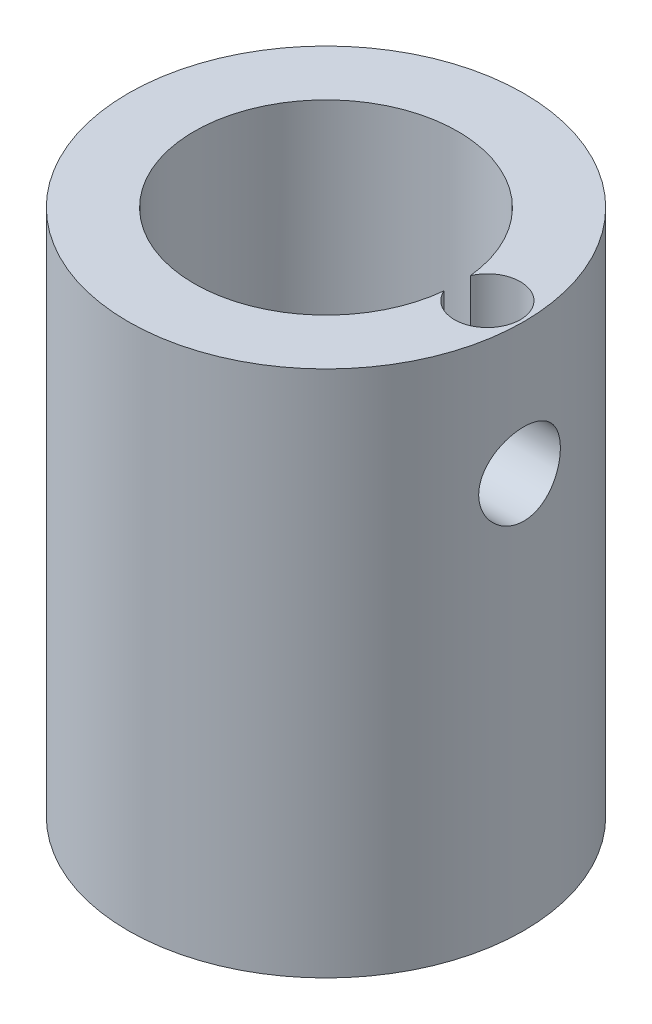
ISO-10303-21;
HEADER;
FILE_DESCRIPTION(('STEP AP214'),'2;1');
FILE_NAME('part.step','',(''),(''),'','','');
FILE_SCHEMA(('AUTOMOTIVE_DESIGN { 1 0 10303 214 1 1 1 1 }'));
ENDSEC;
DATA;
#1=APPLICATION_CONTEXT('core data for automotive mechanical design processes');
#2=APPLICATION_PROTOCOL_DEFINITION('international standard','automotive_design',2000,#1);
#3=PRODUCT_CONTEXT('',#1,'mechanical');
#4=PRODUCT('Part','Part','',(#3));
#5=PRODUCT_RELATED_PRODUCT_CATEGORY('part','',(#4));
#6=PRODUCT_DEFINITION_FORMATION('','',#4);
#7=PRODUCT_DEFINITION_CONTEXT('part definition',#1,'design');
#8=PRODUCT_DEFINITION('design','',#6,#7);
#9=PRODUCT_DEFINITION_SHAPE('','',#8);
#10=(LENGTH_UNIT() NAMED_UNIT(*) SI_UNIT(.MILLI.,.METRE.));
#11=(NAMED_UNIT(*) PLANE_ANGLE_UNIT() SI_UNIT($,.RADIAN.));
#12=(NAMED_UNIT(*) SI_UNIT($,.STERADIAN.) SOLID_ANGLE_UNIT());
#13=UNCERTAINTY_MEASURE_WITH_UNIT(LENGTH_MEASURE(1.E-05),#10,'distance_accuracy_value','');
#14=(GEOMETRIC_REPRESENTATION_CONTEXT(3) GLOBAL_UNCERTAINTY_ASSIGNED_CONTEXT((#13)) GLOBAL_UNIT_ASSIGNED_CONTEXT((#10,
#11,#12)) REPRESENTATION_CONTEXT('',''));
#15=CARTESIAN_POINT('',(0.,0.,0.));
#16=DIRECTION('',(0.,0.,1.));
#17=DIRECTION('',(1.,0.,0.));
#18=AXIS2_PLACEMENT_3D('',#15,#16,#17);
#19=CARTESIAN_POINT('',(0.,80.,0.));
#20=DIRECTION('',(0.,-1.,0.));
#21=DIRECTION('',(0.,0.,-1.));
#22=AXIS2_PLACEMENT_3D('',#19,#20,#21);
#23=CYLINDRICAL_SURFACE('',#22,30.);
#24=CARTESIAN_POINT('',(0.,80.,0.));
#25=DIRECTION('',(0.,1.,0.));
#26=DIRECTION('',(0.,0.,1.));
#27=AXIS2_PLACEMENT_3D('',#24,#25,#26);
#28=CIRCLE('',#27,30.);
#29=CARTESIAN_POINT('',(0.,80.,30.));
#30=VERTEX_POINT('',#29);
#31=EDGE_CURVE('E76',#30,#30,#28,.T.);
#32=ORIENTED_EDGE('',*,*,#31,.F.);
#33=EDGE_LOOP('',(#32));
#34=FACE_BOUND('',#33,.T.);
#35=CARTESIAN_POINT('',(0.,0.,0.));
#36=DIRECTION('',(0.,1.,0.));
#37=DIRECTION('',(0.,0.,1.));
#38=AXIS2_PLACEMENT_3D('',#35,#36,#37);
#39=CIRCLE('',#38,30.);
#40=CARTESIAN_POINT('',(0.,0.,30.));
#41=VERTEX_POINT('',#40);
#42=EDGE_CURVE('E79',#41,#41,#39,.T.);
#43=ORIENTED_EDGE('',*,*,#42,.T.);
#44=EDGE_LOOP('',(#43));
#45=FACE_BOUND('',#44,.T.);
#46=CARTESIAN_POINT('',(29.3532483906951,60.,6.19570891134803));
#47=CARTESIAN_POINT('',(29.353246353925,59.8279373895423,6.1957125374824));
#48=CARTESIAN_POINT('',(29.3547640642741,59.6559192919534,6.18853953342295));
#49=CARTESIAN_POINT('',(29.3607852652423,59.313076969452,6.1599124724872));
#50=CARTESIAN_POINT('',(29.3652892416955,59.1422529433729,6.13845609185349));
#51=CARTESIAN_POINT('',(29.3771549134976,58.8030010858899,6.08141521135679));
#52=CARTESIAN_POINT('',(29.3845180301899,58.6345744895411,6.0458236843916));
#53=CARTESIAN_POINT('',(29.4018872180194,58.3013305931632,5.96078108119698));
#54=CARTESIAN_POINT('',(29.4118942624853,58.136514646597,5.91132490045903));
#55=CARTESIAN_POINT('',(29.4342423589189,57.8119386166724,5.79902115556941));
#56=CARTESIAN_POINT('',(29.4465800848149,57.6521717026327,5.73619265880657));
#57=CARTESIAN_POINT('',(29.473249612199,57.3384803173955,5.59754760980832));
#58=CARTESIAN_POINT('',(29.4875821490523,57.1845580275106,5.52172626550714));
#59=CARTESIAN_POINT('',(29.517825800768,56.883713475229,5.35769617764507));
#60=CARTESIAN_POINT('',(29.5337362301871,56.7367882139946,5.26949280603089));
#61=CARTESIAN_POINT('',(29.5667035876194,56.4507803317589,5.08125660367141));
#62=CARTESIAN_POINT('',(29.5837609430631,56.3117006705233,4.98121935207178));
#63=CARTESIAN_POINT('',(29.6187764137092,56.0405762486728,4.76863051338756));
#64=CARTESIAN_POINT('',(29.6367434304656,55.9086481928679,4.65593152670186));
#65=CARTESIAN_POINT('',(29.6728708400931,55.6546711457032,4.41984144744208));
#66=CARTESIAN_POINT('',(29.6910313021796,55.5326258346403,4.29644640679302));
#67=CARTESIAN_POINT('',(29.7270288306404,55.2993260877785,4.03986753323509));
#68=CARTESIAN_POINT('',(29.7448659901802,55.1880685017752,3.90668657807489));
#69=CARTESIAN_POINT('',(29.7797346125942,54.9770287239509,3.63134519963968));
#70=CARTESIAN_POINT('',(29.7967657761627,54.8772507756992,3.48918148568574));
#71=CARTESIAN_POINT('',(29.8296902119785,54.6890782436484,3.19555844128118));
#72=CARTESIAN_POINT('',(29.8455718958802,54.6007938983129,3.04402711583113));
#73=CARTESIAN_POINT('',(29.8755826985667,54.437292867655,2.73383528442119));
#74=CARTESIAN_POINT('',(29.8897111587746,54.3620810886559,2.57517212978056));
#75=CARTESIAN_POINT('',(29.9157988886229,54.225370219494,2.2519354971806));
#76=CARTESIAN_POINT('',(29.9277591295908,54.1638649861722,2.08736470553058));
#77=CARTESIAN_POINT('',(29.9491822197055,54.0549915647281,1.75345483518811));
#78=CARTESIAN_POINT('',(29.958644162967,54.007628503759,1.58411405145559));
#79=CARTESIAN_POINT('',(29.9826020405662,53.8885679309219,1.07556432546471));
#80=CARTESIAN_POINT('',(29.9930812308343,53.8378145573566,0.730879967415714));
#81=CARTESIAN_POINT('',(29.9997596200984,53.8054604126224,0.211591695517816));
#82=CARTESIAN_POINT('',(30.0004774770096,53.8019791393531,0.0380480317404797));
#83=CARTESIAN_POINT('',(29.9989119509306,53.8095598027702,-0.308729160337855));
#84=CARTESIAN_POINT('',(29.9966285218888,53.8206219626098,-0.481962683839248));
#85=CARTESIAN_POINT('',(29.9854449305899,53.8750314506655,-0.993942017413891));
#86=CARTESIAN_POINT('',(29.9722798047128,53.9392633016099,-1.33061116961305));
#87=CARTESIAN_POINT('',(29.9358672881531,54.1220046161494,-1.98811026191351));
#88=CARTESIAN_POINT('',(29.9126194755526,54.2405163511394,-2.30893953855726));
#89=CARTESIAN_POINT('',(29.8583668564008,54.5292546769044,-2.92834957463891));
#90=CARTESIAN_POINT('',(29.8273114691532,54.6998200972894,-3.22676810539984));
#91=CARTESIAN_POINT('',(29.7608595896882,55.0875717274217,-3.79105705118674));
#92=CARTESIAN_POINT('',(29.7254625668109,55.3047636385677,-4.0569234795546));
#93=CARTESIAN_POINT('',(29.6534559164373,55.7843884654043,-4.5537713207849));
#94=CARTESIAN_POINT('',(29.6168359777846,56.047586764914,-4.78401304852448));
#95=CARTESIAN_POINT('',(29.5471317171544,56.6092321126755,-5.19721566642975));
#96=CARTESIAN_POINT('',(29.514047471231,56.9076799188678,-5.38017553966375));
#97=CARTESIAN_POINT('',(29.4551377834795,57.5324599116484,-5.693901900287));
#98=CARTESIAN_POINT('',(29.4293299803094,57.8588573978365,-5.82454187678811));
#99=CARTESIAN_POINT('',(29.3881487275834,58.529628064925,-6.02890481244648));
#100=CARTESIAN_POINT('',(29.3727738193511,58.8739987256503,-6.10263572854902));
#101=CARTESIAN_POINT('',(29.3544932159667,59.5642171019444,-6.18996799972374));
#102=CARTESIAN_POINT('',(29.3513653994408,59.9099235426462,-6.20464061413359));
#103=CARTESIAN_POINT('',(29.3573359009114,60.5988436255209,-6.17632831510769));
#104=CARTESIAN_POINT('',(29.3664334764793,60.9420574177959,-6.13334690291011));
#105=CARTESIAN_POINT('',(29.3956210788608,61.6126051687693,-5.991872551742));
#106=CARTESIAN_POINT('',(29.4155965196046,61.9400665918975,-5.89395795243787));
#107=CARTESIAN_POINT('',(29.4641877047359,62.5739367129047,-5.64601647669012));
#108=CARTESIAN_POINT('',(29.4928042006705,62.880343576738,-5.49598506726903));
#109=CARTESIAN_POINT('',(29.5559483018901,63.4680756935268,-5.14567039007435));
#110=CARTESIAN_POINT('',(29.5905522351096,63.7489951290846,-4.94472037853521));
#111=CARTESIAN_POINT('',(29.6615660543381,64.2735205257486,-4.49913890798842));
#112=CARTESIAN_POINT('',(29.6979761388411,64.5171223736133,-4.2545026401948));
#113=CARTESIAN_POINT('',(29.7692227410128,64.9641747256337,-3.72373494258727));
#114=CARTESIAN_POINT('',(29.8040235094208,65.1668986223412,-3.43698697865907));
#115=CARTESIAN_POINT('',(29.8675039652918,65.5213391544301,-2.83268676901214));
#116=CARTESIAN_POINT('',(29.896183920353,65.6730580198863,-2.51513587086153));
#117=CARTESIAN_POINT('',(29.9321058958336,65.8584396811344,-2.02387067137091));
#118=CARTESIAN_POINT('',(29.9428789333607,65.9131171948548,-1.85805440260508));
#119=CARTESIAN_POINT('',(29.9618233688853,66.0083170123022,-1.52227725878781));
#120=CARTESIAN_POINT('',(29.9699957229573,66.0488445184494,-1.35231793162088));
#121=CARTESIAN_POINT('',(29.9835025459055,66.1154142061507,-1.00947065775587));
#122=CARTESIAN_POINT('',(29.9888367685993,66.141455131133,-0.8365824583461));
#123=CARTESIAN_POINT('',(29.9965148369705,66.1788388142323,-0.489159883490491));
#124=CARTESIAN_POINT('',(29.9988587943078,66.1901821211757,-0.314625569757645));
#125=CARTESIAN_POINT('',(30.000473507162,66.1980022637404,0.0315466013501721));
#126=CARTESIAN_POINT('',(29.9998004638372,66.1947509683032,0.20317813050534));
#127=CARTESIAN_POINT('',(29.9955278511958,66.1740264686631,0.545541023431393));
#128=CARTESIAN_POINT('',(29.9919283383264,66.1565535387743,0.716272404500853));
#129=CARTESIAN_POINT('',(29.981901902709,66.1075220249225,1.05564357140904));
#130=CARTESIAN_POINT('',(29.9754745164708,66.0759611319208,1.22428300971632));
#131=CARTESIAN_POINT('',(29.9599728267241,65.9990164617122,1.55818923155108));
#132=CARTESIAN_POINT('',(29.9508994680988,65.9536376186734,1.72345719653722));
#133=CARTESIAN_POINT('',(29.9303773552664,65.8495208432383,2.04916604521535));
#134=CARTESIAN_POINT('',(29.918933975402,65.7908131074094,2.20961692573224));
#135=CARTESIAN_POINT('',(29.8939747924758,65.660444069556,2.52493107031361));
#136=CARTESIAN_POINT('',(29.8804597224677,65.5887873478453,2.67979628697717));
#137=CARTESIAN_POINT('',(29.8517125198947,65.4329927449312,2.98302979622553));
#138=CARTESIAN_POINT('',(29.8364796751343,65.3488496822454,3.13139535837179));
#139=CARTESIAN_POINT('',(29.8047155864862,65.1687264593224,3.42053777359005));
#140=CARTESIAN_POINT('',(29.7881847875861,65.0727503495195,3.56131719980354));
#141=CARTESIAN_POINT('',(29.7539647248054,64.867813375006,3.83682022271946));
#142=CARTESIAN_POINT('',(29.7362602618589,64.7586548608196,3.97139494660367));
#143=CARTESIAN_POINT('',(29.7004544511816,64.5295253451687,4.23085743434911));
#144=CARTESIAN_POINT('',(29.6823532445249,64.4095581413312,4.35574857205939));
#145=CARTESIAN_POINT('',(29.646237784645,64.1595111874748,4.59513331214217));
#146=CARTESIAN_POINT('',(29.6282235899244,64.0294254301634,4.70962064906876));
#147=CARTESIAN_POINT('',(29.5928017004414,63.7601234721796,4.92729605485228));
#148=CARTESIAN_POINT('',(29.5753937856481,63.6209106379053,5.03048825269439));
#149=CARTESIAN_POINT('',(29.5414637745758,63.3325119895073,5.22607811831578));
#150=CARTESIAN_POINT('',(29.5249548644251,63.1832262944427,5.31833088756377));
#151=CARTESIAN_POINT('',(29.4935397496458,62.8772969641982,5.48987402771749));
#152=CARTESIAN_POINT('',(29.4786329552918,62.7206560671252,5.56916917384908));
#153=CARTESIAN_POINT('',(29.4508640998844,62.4011462387229,5.71419809023623));
#154=CARTESIAN_POINT('',(29.438000833157,62.2382810506037,5.77993986380141));
#155=CARTESIAN_POINT('',(29.4146958345939,61.9074566050944,5.897392662984));
#156=CARTESIAN_POINT('',(29.4042536457626,61.7394983158423,5.94910633681787));
#157=CARTESIAN_POINT('',(29.381537445301,61.3139698859119,6.06052953791443));
#158=CARTESIAN_POINT('',(29.3709892696971,61.0538682346629,6.111150176068));
#159=CARTESIAN_POINT('',(29.356846443351,60.5291425372001,6.17873642037534));
#160=CARTESIAN_POINT('',(29.3532515219023,60.2645186674516,6.19570333674802));
#161=CARTESIAN_POINT('',(29.3532483906951,60.,6.19570891134803));
#162=B_SPLINE_CURVE_WITH_KNOTS('',3,(#46,#47,#48,#49,#50,#51,#52,#53,#54,#55,#56,#57,#58,#59,
#60,#61,#62,#63,#64,#65,#66,#67,#68,#69,#70,#71,#72,#73,#74,#75,#76,#77,#78,#79,#80,#81,#82,#83,
#84,#85,#86,#87,#88,#89,#90,#91,#92,#93,#94,#95,#96,#97,#98,#99,#100,#101,#102,#103,#104,#105,
#106,#107,#108,#109,#110,#111,#112,#113,#114,#115,#116,#117,#118,#119,#120,#121,#122,#123,#124,
#125,#126,#127,#128,#129,#130,#131,#132,#133,#134,#135,#136,#137,#138,#139,#140,#141,#142,#143,
#144,#145,#146,#147,#148,#149,#150,#151,#152,#153,#154,#155,#156,#157,#158,#159,#160,#161),
.UNSPECIFIED.,.T.,.F.,(4,2,2,2,2,2,2,2,2,2,2,2,2,2,2,2,2,2,2,2,2,2,2,2,2,2,2,2,2,2,2,2,2,2,2,2,
2,2,2,2,2,2,2,2,2,2,2,2,2,2,2,2,2,2,2,2,2,4),(0.,0.515955181010521,1.03199432310506,
1.54829032905197,2.06477666836801,2.58053143296204,3.09647683100171,3.6121990738038,
4.12811459016278,4.65082143216769,5.17372204151332,5.69646949192882,6.21940956476584,
6.7470444374867,7.2748769135994,7.80247234169866,8.33025881451432,9.3698782255065,
9.89010873409632,10.410347225149,11.4340803368338,12.4578562915477,13.4884437603046,
14.519157319194,15.569015551175,16.6188963614853,17.6713007019699,18.7235578700822,
19.756639705587,20.7896588065001,21.8120009755398,22.8344320873764,23.8710135549175,
24.9077091950816,25.9614627524627,27.0151702309594,27.5394357720417,28.0635083571246,
28.5876263933899,29.1117248579095,29.6261013264392,30.1404678736538,30.6549187573026,
31.1691861537955,31.6822999034147,32.1952325085006,32.7083785646005,33.2213494567062,
33.7432871598374,34.2650421902986,34.7871093815573,35.3089850870876,35.8371431339964,
36.3651060996236,36.892756402772,37.4203070269749,38.2135362496047,39.0067345893404),.UNSPECIFIED.);
#163=CARTESIAN_POINT('',(29.3532483906951,60.,6.19570891134803));
#164=VERTEX_POINT('',#163);
#165=EDGE_CURVE('E71',#164,#164,#162,.T.);
#166=ORIENTED_EDGE('',*,*,#165,.F.);
#167=EDGE_LOOP('',(#166));
#168=FACE_BOUND('',#167,.T.);
#169=ADVANCED_FACE('F33',(#34,#45,#168),#23,.T.);
#170=CARTESIAN_POINT('',(0.,3.,0.));
#171=DIRECTION('',(0.,1.,0.));
#172=DIRECTION('',(0.,0.,1.));
#173=AXIS2_PLACEMENT_3D('',#170,#171,#172);
#174=CYLINDRICAL_SURFACE('',#173,20.);
#175=CARTESIAN_POINT('',(0.,3.,0.));
#176=DIRECTION('',(0.,1.,0.));
#177=DIRECTION('',(0.,0.,1.));
#178=AXIS2_PLACEMENT_3D('',#175,#176,#177);
#179=CIRCLE('',#178,20.);
#180=CARTESIAN_POINT('',(0.,3.,20.));
#181=VERTEX_POINT('',#180);
#182=EDGE_CURVE('E82',#181,#181,#179,.T.);
#183=ORIENTED_EDGE('',*,*,#182,.F.);
#184=EDGE_LOOP('',(#183));
#185=FACE_BOUND('',#184,.T.);
#186=CARTESIAN_POINT('',(19.0161297609646,60.,6.19570891134803));
#187=CARTESIAN_POINT('',(19.0161212499526,60.1695392528851,6.19572131240288));
#188=CARTESIAN_POINT('',(19.0184014247644,60.3389698933915,6.18874879190105));
#189=CARTESIAN_POINT('',(19.0274149100442,60.6765970582187,6.16098235585591));
#190=CARTESIAN_POINT('',(19.0341484790479,60.8447935103172,6.14018763788359));
#191=CARTESIAN_POINT('',(19.060779649376,61.3456518933459,6.05725285467361));
#192=CARTESIAN_POINT('',(19.0871081089449,61.6748134470954,5.97456186983717));
#193=CARTESIAN_POINT('',(19.1536683759922,62.3131961498796,5.75757410409601));
#194=CARTESIAN_POINT('',(19.1938758965004,62.6224510193744,5.62336742485627));
#195=CARTESIAN_POINT('',(19.2836574150221,63.2143122419485,5.30729724994926));
#196=CARTESIAN_POINT('',(19.3332330127038,63.4969140314449,5.12542561308388));
#197=CARTESIAN_POINT('',(19.4113796448308,63.8995693711788,4.81767678918897));
#198=CARTESIAN_POINT('',(19.4384988047976,64.0320757592885,4.70732372854738));
#199=CARTESIAN_POINT('',(19.4930606370278,64.2873927484723,4.47601332479218));
#200=CARTESIAN_POINT('',(19.5205031972625,64.4102065998735,4.35505956551515));
#201=CARTESIAN_POINT('',(19.5749854267719,64.6454251518352,4.10323631812367));
#202=CARTESIAN_POINT('',(19.6020248884163,64.7578246336575,3.97236191776678));
#203=CARTESIAN_POINT('',(19.6549526595593,64.971385090689,3.70160145221855));
#204=CARTESIAN_POINT('',(19.68084139157,65.072550211593,3.56171874157468));
#205=CARTESIAN_POINT('',(19.7313491541909,65.2651479755814,3.2705025007975));
#206=CARTESIAN_POINT('',(19.7559261447623,65.3563082792318,3.11898137299935));
#207=CARTESIAN_POINT('',(19.802455905572,65.5254574825797,2.80844720670818));
#208=CARTESIAN_POINT('',(19.8244097038198,65.6034515470068,2.6494371373604));
#209=CARTESIAN_POINT('',(19.8650807758115,65.7456845504812,2.32493171712255));
#210=CARTESIAN_POINT('',(19.8837973079344,65.8099203384639,2.15943489081296));
#211=CARTESIAN_POINT('',(19.9174356340138,65.9240210007936,1.82325971356578));
#212=CARTESIAN_POINT('',(19.9323590889091,65.9738921664994,1.65258366731712));
#213=CARTESIAN_POINT('',(19.9575965923238,66.0575583444988,1.31245640378635));
#214=CARTESIAN_POINT('',(19.9680354532876,66.0917906212314,1.14312195630659));
#215=CARTESIAN_POINT('',(19.9846405857409,66.146001595288,0.802045730115178));
#216=CARTESIAN_POINT('',(19.9908085769596,66.1659860298135,0.630304948803489));
#217=CARTESIAN_POINT('',(19.9987028311384,66.1915322611803,0.285652116012715));
#218=CARTESIAN_POINT('',(20.0004290970454,66.1970940675897,0.112740065310753));
#219=CARTESIAN_POINT('',(19.9993903373656,66.1937408696568,-0.232928311827829));
#220=CARTESIAN_POINT('',(19.9966254002156,66.1848261503732,-0.405684641263752));
#221=CARTESIAN_POINT('',(19.9868541083336,66.1531586840393,-0.743837225473005));
#222=CARTESIAN_POINT('',(19.9799958881157,66.1308891160104,-0.909283288736585));
#223=CARTESIAN_POINT('',(19.9623437487043,66.0731156086434,-1.23769233762555));
#224=CARTESIAN_POINT('',(19.9515484917948,66.0376071709457,-1.40065445963396));
#225=CARTESIAN_POINT('',(19.9263100957244,65.9536747110177,-1.72286830911467));
#226=CARTESIAN_POINT('',(19.9118681422915,65.9052548866557,-1.88212122429196));
#227=CARTESIAN_POINT('',(19.8797023780237,65.7958698510993,-2.19598072795561));
#228=CARTESIAN_POINT('',(19.86197733221,65.7348999180512,-2.35058554247585));
#229=CARTESIAN_POINT('',(19.8234759691749,65.6001095624441,-2.65589021726005));
#230=CARTESIAN_POINT('',(19.8026662937193,65.526146768142,-2.80652298370574));
#231=CARTESIAN_POINT('',(19.7586810458448,65.3663937517124,-3.10108200344967));
#232=CARTESIAN_POINT('',(19.7355046628914,65.2805994740668,-3.24500593440607));
#233=CARTESIAN_POINT('',(19.6873798325461,65.097794312439,-3.52523616388491));
#234=CARTESIAN_POINT('',(19.6624313243396,65.0007830434479,-3.6615422006945));
#235=CARTESIAN_POINT('',(19.61139171264,64.796176260086,-3.92573821205312));
#236=CARTESIAN_POINT('',(19.5853005734798,64.6885804151898,-4.05362792357657));
#237=CARTESIAN_POINT('',(19.5315475636985,64.458827082163,-4.30533247351813));
#238=CARTESIAN_POINT('',(19.5038652663148,64.3362522993907,-4.42876236146993));
#239=CARTESIAN_POINT('',(19.4487452466801,64.0811761342746,-4.66486915861869));
#240=CARTESIAN_POINT('',(19.421307449155,63.9486779341465,-4.77754948882388));
#241=CARTESIAN_POINT('',(19.3674195681297,63.674482779979,-4.99151681197244));
#242=CARTESIAN_POINT('',(19.3409699725187,63.5327813743056,-5.09279822549468));
#243=CARTESIAN_POINT('',(19.2898388886837,63.2411856267849,-5.28316470474441));
#244=CARTESIAN_POINT('',(19.2651567137931,63.0912945070942,-5.37225451946231));
#245=CARTESIAN_POINT('',(19.2180107358053,62.7824960399876,-5.5385577366134));
#246=CARTESIAN_POINT('',(19.1955750800588,62.6235060947416,-5.61562591955036));
#247=CARTESIAN_POINT('',(19.1539493944526,62.2992231362806,-5.75600424416786));
#248=CARTESIAN_POINT('',(19.1347581175541,62.1339325749021,-5.81931967465847));
#249=CARTESIAN_POINT('',(19.1002301102528,61.7981865024331,-5.93166646348126));
#250=CARTESIAN_POINT('',(19.0848930317962,61.6277314592804,-5.98069911168469));
#251=CARTESIAN_POINT('',(19.0585820651715,61.2829262203343,-6.06402203614821));
#252=CARTESIAN_POINT('',(19.047607988069,61.1085761935536,-6.09831295078559));
#253=CARTESIAN_POINT('',(19.0307371651006,60.7642967623356,-6.15075361514062));
#254=CARTESIAN_POINT('',(19.0246567739343,60.5944652466617,-6.16948811806385));
#255=CARTESIAN_POINT('',(19.0170599066417,60.2537349943093,-6.19286570343731));
#256=CARTESIAN_POINT('',(19.0155432982386,60.0828362887062,-6.19750919430187));
#257=CARTESIAN_POINT('',(19.0171228927843,59.7412851892966,-6.19266039301225));
#258=CARTESIAN_POINT('',(19.0202184724694,59.5706327653283,-6.18317001082566));
#259=CARTESIAN_POINT('',(19.03092132361,59.2308367032177,-6.15014909725777));
#260=CARTESIAN_POINT('',(19.0385285528335,59.0616930509673,-6.12661869729986));
#261=CARTESIAN_POINT('',(19.0577333283313,58.7309494079098,-6.06661023446674));
#262=CARTESIAN_POINT('',(19.0692109942378,58.5692717989532,-6.03052021942684));
#263=CARTESIAN_POINT('',(19.0958597892953,58.2495549003444,-5.94559651725915));
#264=CARTESIAN_POINT('',(19.1110321496676,58.0915168427938,-5.89675858161846));
#265=CARTESIAN_POINT('',(19.1446279932618,57.7801943483155,-5.78675403954404));
#266=CARTESIAN_POINT('',(19.1630507128464,57.626908804759,-5.72559032844075));
#267=CARTESIAN_POINT('',(19.202643442659,57.3259411385565,-5.59136650487168));
#268=CARTESIAN_POINT('',(19.2238144923606,57.1782611635012,-5.51830188856843));
#269=CARTESIAN_POINT('',(19.2689490329168,56.8854019629973,-5.35860765646827));
#270=CARTESIAN_POINT('',(19.2929739810124,56.740407650061,-5.27165628715144));
#271=CARTESIAN_POINT('',(19.3426620920464,56.4581505594042,-5.08631770543694));
#272=CARTESIAN_POINT('',(19.3683258198593,56.3208904786369,-4.98792654013424));
#273=CARTESIAN_POINT('',(19.4205960860829,56.0549572226254,-4.78036590954075));
#274=CARTESIAN_POINT('',(19.4472026776598,55.9262845327897,-4.67119583582766));
#275=CARTESIAN_POINT('',(19.5006583187283,55.6782933903492,-4.44275631502535));
#276=CARTESIAN_POINT('',(19.5275073727569,55.5589751131877,-4.32348667860458));
#277=CARTESIAN_POINT('',(19.5818417099268,55.3257387041607,-4.07048977871195));
#278=CARTESIAN_POINT('',(19.6093081525541,55.2122405384819,-3.93637086789064));
#279=CARTESIAN_POINT('',(19.6629764212384,54.9969693351216,-3.65886871758531));
#280=CARTESIAN_POINT('',(19.6891786720705,54.895192342894,-3.515488628316));
#281=CARTESIAN_POINT('',(19.7396084389484,54.704014961694,-3.22029246725892));
#282=CARTESIAN_POINT('',(19.7638352338819,54.6146190840276,-3.06847334863091));
#283=CARTESIAN_POINT('',(19.8096132554116,54.4489710393623,-2.75751795533781));
#284=CARTESIAN_POINT('',(19.8311655892899,54.3727134277364,-2.59838474650539));
#285=CARTESIAN_POINT('',(19.8708531838593,54.2344146557152,-2.27498233424764));
#286=CARTESIAN_POINT('',(19.8890114115199,54.1722772798371,-2.11075712524186));
#287=CARTESIAN_POINT('',(19.9215728994984,54.0621008139767,-1.77734997508511));
#288=CARTESIAN_POINT('',(19.9359776583114,54.0140560968248,-1.60817004210527));
#289=CARTESIAN_POINT('',(19.9606239795337,53.9324772698427,-1.26605642384677));
#290=CARTESIAN_POINT('',(19.9708657708298,53.8989423622322,-1.09312294549526));
#291=CARTESIAN_POINT('',(19.9868861512344,53.8467043573351,-0.744827362645454));
#292=CARTESIAN_POINT('',(19.9926649014487,53.8280007246718,-0.569465346044626));
#293=CARTESIAN_POINT('',(19.999446479878,53.8060699198237,-0.224939586480327));
#294=CARTESIAN_POINT('',(20.0006360682198,53.8022375099906,-0.0558177600727351));
#295=CARTESIAN_POINT('',(19.9987232678337,53.8084129125743,0.282208367463739));
#296=CARTESIAN_POINT('',(19.9956194114587,53.8184254576729,0.451112574444826));
#297=CARTESIAN_POINT('',(19.985204153134,53.8521995152879,0.787332863963706));
#298=CARTESIAN_POINT('',(19.9778945862189,53.8759550314992,0.954649606800239));
#299=CARTESIAN_POINT('',(19.9592643768583,53.9370067024604,1.28662993016474));
#300=CARTESIAN_POINT('',(19.947942236909,53.9743079126311,1.45129249612719));
#301=CARTESIAN_POINT('',(19.9217570330026,54.061572568294,1.77470877473025));
#302=CARTESIAN_POINT('',(19.9069400833507,54.1113716100715,1.93351065864632));
#303=CARTESIAN_POINT('',(19.8740693838451,54.2234687303016,2.24635605886213));
#304=CARTESIAN_POINT('',(19.8560144716554,54.2857712981225,2.40039784306657));
#305=CARTESIAN_POINT('',(19.8171355265992,54.4223702885719,2.70265704909591));
#306=CARTESIAN_POINT('',(19.7963121458821,54.4966638874344,2.85087583198555));
#307=CARTESIAN_POINT('',(19.7524069582953,54.6567505467495,3.14068633703466));
#308=CARTESIAN_POINT('',(19.7293242980249,54.7425479571143,3.28227552490048));
#309=CARTESIAN_POINT('',(19.6806854475628,54.928071025087,3.56251471437829));
#310=CARTESIAN_POINT('',(19.6550726300488,55.0281640832201,3.70091174051971));
#311=CARTESIAN_POINT('',(19.6027171822216,55.2393492561337,3.96889523633343));
#312=CARTESIAN_POINT('',(19.5759741339696,55.350445460442,4.09847839975583));
#313=CARTESIAN_POINT('',(19.5220721453129,55.582887096964,4.347986964095));
#314=CARTESIAN_POINT('',(19.4949132390823,55.7042316906514,4.46791315358283));
#315=CARTESIAN_POINT('',(19.4408870606861,55.9564769342177,4.69742672128967));
#316=CARTESIAN_POINT('',(19.4140199004193,56.0873811116089,4.80701024849543));
#317=CARTESIAN_POINT('',(19.3604594246975,56.3622877317485,5.01845489487124));
#318=CARTESIAN_POINT('',(19.3337997116495,56.5065765727687,5.11995258638976));
#319=CARTESIAN_POINT('',(19.2823565635445,56.8035234935873,5.3104105201597));
#320=CARTESIAN_POINT('',(19.2575731254251,56.9561815597256,5.39937078287371));
#321=CARTESIAN_POINT('',(19.2106413506404,57.2688066964315,5.56404451623929));
#322=CARTESIAN_POINT('',(19.1884921026204,57.4287712125102,5.63976257260803));
#323=CARTESIAN_POINT('',(19.1475132766086,57.7549497163595,5.77736016323861));
#324=CARTESIAN_POINT('',(19.1286834875091,57.9211633058915,5.83924057760031));
#325=CARTESIAN_POINT('',(19.0964804263588,58.2433930443799,5.94366518905036));
#326=CARTESIAN_POINT('',(19.0827677133007,58.3989722154127,5.9874518896817));
#327=CARTESIAN_POINT('',(19.0589623194325,58.7133287703397,6.06279416965477));
#328=CARTESIAN_POINT('',(19.0488705755954,58.8721069708151,6.0943465833854));
#329=CARTESIAN_POINT('',(19.0245194056888,59.3516624558221,6.17015613342455));
#330=CARTESIAN_POINT('',(19.0161460245528,59.676029526517,6.19568521432484));
#331=CARTESIAN_POINT('',(19.0161297609646,60.,6.19570891134803));
#332=B_SPLINE_CURVE_WITH_KNOTS('',3,(#186,#187,#188,#189,#190,#191,#192,#193,#194,#195,#196,
#197,#198,#199,#200,#201,#202,#203,#204,#205,#206,#207,#208,#209,#210,#211,#212,#213,#214,#215,
#216,#217,#218,#219,#220,#221,#222,#223,#224,#225,#226,#227,#228,#229,#230,#231,#232,#233,#234,
#235,#236,#237,#238,#239,#240,#241,#242,#243,#244,#245,#246,#247,#248,#249,#250,#251,#252,#253,
#254,#255,#256,#257,#258,#259,#260,#261,#262,#263,#264,#265,#266,#267,#268,#269,#270,#271,#272,
#273,#274,#275,#276,#277,#278,#279,#280,#281,#282,#283,#284,#285,#286,#287,#288,#289,#290,#291,
#292,#293,#294,#295,#296,#297,#298,#299,#300,#301,#302,#303,#304,#305,#306,#307,#308,#309,#310,
#311,#312,#313,#314,#315,#316,#317,#318,#319,#320,#321,#322,#323,#324,#325,#326,#327,#328,#329,
#330,#331),.UNSPECIFIED.,.T.,.F.,(4,2,2,2,2,2,2,2,2,2,2,2,2,2,2,2,2,2,2,2,2,2,2,2,2,2,2,2,2,2,2,
2,2,2,2,2,2,2,2,2,2,2,2,2,2,2,2,2,2,2,2,2,2,2,2,2,2,2,2,2,2,2,2,2,2,2,2,2,2,2,2,2,4),(0.,
0.508251369471302,1.01653224736694,2.03241137920862,3.04652176112206,4.06080546659674,
4.58399918354552,5.10701669882532,5.6302949014357,6.1533793581289,6.68831163494246,
7.22303358342454,7.75787786888369,8.29248754798364,8.81106449814046,9.32943251396421,
9.84780018589083,10.3661576507036,10.8668055360145,11.3676236888656,11.868279209251,
12.3691234417376,12.8758436529278,13.3827379880697,13.8896497268805,14.3965773000954,
14.9243896157198,15.4520333926584,15.9799343220898,16.5076290294874,17.0412730139376,
17.5747114134865,18.108101623522,18.6414687332548,19.1537408533738,19.6659981256398,
20.178186180784,20.690369441601,21.1879581006685,21.6857128038334,22.1833507201899,
22.6811774045487,23.1929020732333,23.7048040916263,24.2167350211891,24.7286755497956,
25.2615376735969,25.7942194878298,26.3270948875152,26.8597489244186,27.3886566791132,
27.9173529536324,28.4460201556002,28.9746682729638,29.4815605258211,29.9886260947301,
30.4954705885073,31.0025044376583,31.5031892702465,32.0040541954733,32.5048013437278,
33.0057383752599,33.5232792707932,34.0410132472431,34.5587049035079,35.0765885641749,
35.611188195527,36.1457869543374,36.6802002158147,37.2145794779374,37.7006373324957,
38.186820870308,39.1580321621708),.UNSPECIFIED.);
#333=CARTESIAN_POINT('',(19.8992479272115,65.862326925615,-2.0049767907304));
#334=VERTEX_POINT('',#333);
#335=CARTESIAN_POINT('',(19.8992479272115,65.8623269256149,2.0049767907304));
#336=VERTEX_POINT('',#335);
#337=EDGE_CURVE('E52',#334,#336,#332,.T.);
#338=ORIENTED_EDGE('',*,*,#337,.F.);
#339=DIRECTION('',(0.,1.,0.));
#340=VECTOR('',#339,1.);
#341=CARTESIAN_POINT('',(19.8992479272115,70.,-2.0049767907304));
#342=LINE('',#341,#340);
#343=CARTESIAN_POINT('',(19.8992479272115,80.,-2.0049767907304));
#344=VERTEX_POINT('',#343);
#345=EDGE_CURVE('E47',#334,#344,#342,.T.);
#346=ORIENTED_EDGE('',*,*,#345,.T.);
#347=CARTESIAN_POINT('',(0.,80.,0.));
#348=DIRECTION('',(0.,1.,0.));
#349=DIRECTION('',(0.,0.,1.));
#350=AXIS2_PLACEMENT_3D('',#347,#348,#349);
#351=CIRCLE('',#350,20.);
#352=CARTESIAN_POINT('',(19.8992479272115,80.,2.0049767907304));
#353=VERTEX_POINT('',#352);
#354=EDGE_CURVE('E85',#344,#353,#351,.T.);
#355=ORIENTED_EDGE('',*,*,#354,.T.);
#356=DIRECTION('',(0.,1.,0.));
#357=VECTOR('',#356,1.);
#358=CARTESIAN_POINT('',(19.8992479272115,70.,2.0049767907304));
#359=LINE('',#358,#357);
#360=EDGE_CURVE('E59',#353,#336,#359,.F.);
#361=ORIENTED_EDGE('',*,*,#360,.T.);
#362=EDGE_LOOP('',(#338,#346,#355,#361));
#363=FACE_BOUND('',#362,.T.);
#364=ADVANCED_FACE('F69',(#185,#363),#174,.F.);
#365=CARTESIAN_POINT('',(24.4796483538808,60.,0.));
#366=DIRECTION('',(0.,1.,0.));
#367=DIRECTION('',(0.,0.,1.));
#368=AXIS2_PLACEMENT_3D('',#365,#366,#367);
#369=CYLINDRICAL_SURFACE('',#368,5.);
#370=CARTESIAN_POINT('',(19.8992479272115,65.862326925615,2.00497679073039));
#371=CARTESIAN_POINT('',(19.9589028368991,65.8157330794499,2.1412644754));
#372=CARTESIAN_POINT('',(20.0240939514208,65.7651365860846,2.27363556602785));
#373=CARTESIAN_POINT('',(20.1644531304792,65.657353719943,2.52989970248008));
#374=CARTESIAN_POINT('',(20.239607301248,65.6001765385015,2.65380419705853));
#375=CARTESIAN_POINT('',(20.3985923873434,65.4807932338684,2.892306579062));
#376=CARTESIAN_POINT('',(20.4823808099951,65.4186120404885,3.00694551544934));
#377=CARTESIAN_POINT('',(20.6581680630153,65.2902652748716,3.22740948730446));
#378=CARTESIAN_POINT('',(20.7501697666503,65.2240983109391,3.33323141307506));
#379=CARTESIAN_POINT('',(20.9412146114405,65.0894745510264,3.53535293374491));
#380=CARTESIAN_POINT('',(21.040215733166,65.0210325413261,3.63170222726755));
#381=CARTESIAN_POINT('',(21.2453006496435,64.8828343541526,3.81548893277525));
#382=CARTESIAN_POINT('',(21.3513843013269,64.8130782032459,3.90292652468859));
#383=CARTESIAN_POINT('',(21.570624276431,64.6735483599928,4.06897112330215));
#384=CARTESIAN_POINT('',(21.6837928540955,64.6037748574726,4.1475621331531));
#385=CARTESIAN_POINT('',(21.9169677094391,64.4660181533971,4.29554691491991));
#386=CARTESIAN_POINT('',(22.0369726029383,64.3980345934713,4.36494253926949));
#387=CARTESIAN_POINT('',(22.3478792700801,64.2315511979874,4.5277345250522));
#388=CARTESIAN_POINT('',(22.5433659953362,64.135440281181,4.61499709285206));
#389=CARTESIAN_POINT('',(22.9507328550462,63.9611534982568,4.76542959030771));
#390=CARTESIAN_POINT('',(23.1625687668355,63.8829313720761,4.82866194872211));
#391=CARTESIAN_POINT('',(23.5486543358994,63.7720298342646,4.91552265877074));
#392=CARTESIAN_POINT('',(23.7196727680851,63.7329195695632,4.94502097441715));
#393=CARTESIAN_POINT('',(24.0674298837731,63.6779693061429,4.98603946741351));
#394=CARTESIAN_POINT('',(24.244157864176,63.6620880863029,4.99759149363525));
#395=CARTESIAN_POINT('',(24.5988302128661,63.6564338445878,5.00173210712879));
#396=CARTESIAN_POINT('',(24.7767766486728,63.6667408980945,4.99426253225779));
#397=CARTESIAN_POINT('',(25.1278663640447,63.7116677854531,4.96095322482011));
#398=CARTESIAN_POINT('',(25.3010013388529,63.7463272344994,4.93508355911021));
#399=CARTESIAN_POINT('',(25.6993019202341,63.8503461923896,4.85461087769987));
#400=CARTESIAN_POINT('',(25.9209381112229,63.9276816424635,4.79304161859373));
#401=CARTESIAN_POINT('',(26.239937729033,64.0590616881232,4.68125890465041));
#402=CARTESIAN_POINT('',(26.3442260854549,64.1055277197716,4.64065773698066));
#403=CARTESIAN_POINT('',(26.5484054283799,64.2022011125474,4.55330100312718));
#404=CARTESIAN_POINT('',(26.648297409187,64.252407620723,4.50654683817721));
#405=CARTESIAN_POINT('',(26.8858961689738,64.3775177195999,4.38572894717255));
#406=CARTESIAN_POINT('',(27.0213411459375,64.453737823442,4.3085809624248));
#407=CARTESIAN_POINT('',(27.2836070880666,64.6084487740682,4.14269170890251));
#408=CARTESIAN_POINT('',(27.4104244306571,64.686940555208,4.05394561543639));
#409=CARTESIAN_POINT('',(27.6552873938255,64.843827578955,3.86512594863722));
#410=CARTESIAN_POINT('',(27.7733372880256,64.9222228500337,3.76505795490127));
#411=CARTESIAN_POINT('',(28.0003149281767,65.0769109445048,3.55372329639197));
#412=CARTESIAN_POINT('',(28.1092455994681,65.1532044368133,3.44246024827545));
#413=CARTESIAN_POINT('',(28.385230532321,65.3503121826247,3.13260191921314));
#414=CARTESIAN_POINT('',(28.5439995084139,65.4678031617788,2.92427844715488));
#415=CARTESIAN_POINT('',(28.8301470285682,65.6837408164262,2.4785266456936));
#416=CARTESIAN_POINT('',(28.9575785556036,65.7822195748759,2.24114847206119));
#417=CARTESIAN_POINT('',(29.1556826541768,65.9370872948306,1.78468102318284));
#418=CARTESIAN_POINT('',(29.232401673389,65.9978361942831,1.56974902280075));
#419=CARTESIAN_POINT('',(29.3254474048744,66.0719221100106,1.23754435066133));
#420=CARTESIAN_POINT('',(29.3527951390085,66.0937816197755,1.12514177985227));
#421=CARTESIAN_POINT('',(29.3997601766011,66.1314034430271,0.897748691309419));
#422=CARTESIAN_POINT('',(29.419380634756,66.1471682446586,0.78275924998829));
#423=CARTESIAN_POINT('',(29.4506423130205,66.1723175508432,0.55047205697397));
#424=CARTESIAN_POINT('',(29.4622468912788,66.1816727545521,0.433166193854837));
#425=CARTESIAN_POINT('',(29.4771315487005,66.1936764137895,0.197681345771069));
#426=CARTESIAN_POINT('',(29.480411611681,66.1963248562801,0.0795023591095263));
#427=CARTESIAN_POINT('',(29.4785868013084,66.1948522407589,-0.156740992505901));
#428=CARTESIAN_POINT('',(29.4734824001389,66.1907315639602,-0.274805363539871));
#429=CARTESIAN_POINT('',(29.4549825327938,66.1758181067597,-0.509850547151648));
#430=CARTESIAN_POINT('',(29.441587369334,66.1650255699639,-0.626831399133087));
#431=CARTESIAN_POINT('',(29.4079408133146,66.1379786879926,-0.850797417226166));
#432=CARTESIAN_POINT('',(29.3882259220768,66.1221523090878,-0.957915588854012));
#433=CARTESIAN_POINT('',(29.34209334928,66.0852273277018,-1.16978694506826));
#434=CARTESIAN_POINT('',(29.3156734059869,66.0641269462414,-1.2745393186186));
#435=CARTESIAN_POINT('',(29.2268597872715,65.9934563899525,-1.58430942914488));
#436=CARTESIAN_POINT('',(29.1548879321009,65.9364969453794,-1.78499827145706));
#437=CARTESIAN_POINT('',(28.9818209168474,65.8011395457809,-2.18682947858129));
#438=CARTESIAN_POINT('',(28.8788300911622,65.7213725713092,-2.38667546223881));
#439=CARTESIAN_POINT('',(28.6505276106331,65.5477525547595,-2.76638718045156));
#440=CARTESIAN_POINT('',(28.5252063814001,65.4538934732739,-2.94624429064933));
#441=CARTESIAN_POINT('',(28.2281151439506,65.236928370992,-3.31914351421022));
#442=CARTESIAN_POINT('',(28.0520712895029,65.1117341022853,-3.50758066835724));
#443=CARTESIAN_POINT('',(27.7696848756611,64.9200017196746,-3.76723370092683));
#444=CARTESIAN_POINT('',(27.6723833645339,64.8553594891435,-3.85003071132359));
#445=CARTESIAN_POINT('',(27.4718228739168,64.725889989444,-4.00788848531828));
#446=CARTESIAN_POINT('',(27.3685657272226,64.6610627829763,-4.08295160934847));
#447=CARTESIAN_POINT('',(27.1576319145,64.5333714180707,-4.2242511117571));
#448=CARTESIAN_POINT('',(27.0500364833372,64.4704925017952,-4.29059554319272));
#449=CARTESIAN_POINT('',(26.8290243761761,64.3471781070927,-4.41548972482471));
#450=CARTESIAN_POINT('',(26.7156066050144,64.2867430922058,-4.47403800109116));
#451=CARTESIAN_POINT('',(26.4830115065452,64.1701524117969,-4.58290155453931));
#452=CARTESIAN_POINT('',(26.3638441632056,64.1139897356367,-4.63323048195021));
#453=CARTESIAN_POINT('',(26.1195813850617,64.0080001540741,-4.72521575111753));
#454=CARTESIAN_POINT('',(25.994489320401,63.9581697047572,-4.76687695227577));
#455=CARTESIAN_POINT('',(25.6987532744494,63.8533850367331,-4.85222811593126));
#456=CARTESIAN_POINT('',(25.5259402411599,63.8015751071223,-4.89259513806946));
#457=CARTESIAN_POINT('',(25.2607503711454,63.7402569269996,-4.9394276647793));
#458=CARTESIAN_POINT('',(25.1714147614151,63.7225561027581,-4.95274823805234));
#459=CARTESIAN_POINT('',(24.9911775700793,63.6933157954517,-4.97459177099308));
#460=CARTESIAN_POINT('',(24.900276781649,63.6817732812349,-4.98311709102142));
#461=CARTESIAN_POINT('',(24.7167837826109,63.6653273990474,-4.99522682411815));
#462=CARTESIAN_POINT('',(24.6241838053746,63.6604795658134,-4.99876991218209));
#463=CARTESIAN_POINT('',(24.4388309297113,63.6578531064785,-5.0006922018963));
#464=CARTESIAN_POINT('',(24.3460780366177,63.6600742388292,-4.99907157999193));
#465=CARTESIAN_POINT('',(24.1611859077553,63.6714719330381,-4.99070651489031));
#466=CARTESIAN_POINT('',(24.069047058051,63.6806525180894,-4.98395910794234));
#467=CARTESIAN_POINT('',(23.8861215779926,63.7055175887121,-4.96549951164886));
#468=CARTESIAN_POINT('',(23.7953357138755,63.72120562472,-4.95378461198344));
#469=CARTESIAN_POINT('',(23.5979968381856,63.7620543166116,-4.92285840107098));
#470=CARTESIAN_POINT('',(23.4918653499417,63.7884729548117,-4.9026243160065));
#471=CARTESIAN_POINT('',(23.2829437989965,63.8482293131187,-4.85585989659659));
#472=CARTESIAN_POINT('',(23.1801564399964,63.8815724783797,-4.82932460487998));
#473=CARTESIAN_POINT('',(22.9779637648127,63.9538487195924,-4.77033217598821));
#474=CARTESIAN_POINT('',(22.8785696229085,63.9927984039922,-4.73785736368361));
#475=CARTESIAN_POINT('',(22.6835937213685,64.0748995792795,-4.66743289827692));
#476=CARTESIAN_POINT('',(22.5880109628212,64.118049958883,-4.62948469187596));
#477=CARTESIAN_POINT('',(22.3536765545494,64.2298060584151,-4.52810418239801));
#478=CARTESIAN_POINT('',(22.2172477076745,64.3003479507992,-4.46141963202611));
#479=CARTESIAN_POINT('',(21.9525367137709,64.4453174683257,-4.31699549101094));
#480=CARTESIAN_POINT('',(21.82425798132,64.5197466986244,-4.23925131042675));
#481=CARTESIAN_POINT('',(21.5758836915954,64.669999779444,-4.07313675401133));
#482=CARTESIAN_POINT('',(21.4557800098243,64.7458221473549,-3.98477717680939));
#483=CARTESIAN_POINT('',(21.2237290031602,64.8969455648182,-3.79752752735951));
#484=CARTESIAN_POINT('',(21.111781768991,64.9722466085633,-3.69863733801002));
#485=CARTESIAN_POINT('',(20.8908056223693,65.1244371977171,-3.48497287336131));
#486=CARTESIAN_POINT('',(20.7822312964628,65.2012056760965,-3.36963997526151));
#487=CARTESIAN_POINT('',(20.5753211204866,65.350275353087,-3.12755047493034));
#488=CARTESIAN_POINT('',(20.4769808635565,65.4225784690153,-3.00079883392177));
#489=CARTESIAN_POINT('',(20.2912248711903,65.5611006422809,-2.73557884287443));
#490=CARTESIAN_POINT('',(20.203847925681,65.6272978888367,-2.59707164442446));
#491=CARTESIAN_POINT('',(20.0416806086904,65.7514978183835,-2.30907188786172));
#492=CARTESIAN_POINT('',(19.9669135721862,65.8094852777976,-2.15955968313762));
#493=CARTESIAN_POINT('',(19.8992479272115,65.862326925615,-2.00497679073044));
#494=B_SPLINE_CURVE_WITH_KNOTS('',3,(#370,#371,#372,#373,#374,#375,#376,#377,#378,#379,#380,
#381,#382,#383,#384,#385,#386,#387,#388,#389,#390,#391,#392,#393,#394,#395,#396,#397,#398,#399,
#400,#401,#402,#403,#404,#405,#406,#407,#408,#409,#410,#411,#412,#413,#414,#415,#416,#417,#418,
#419,#420,#421,#422,#423,#424,#425,#426,#427,#428,#429,#430,#431,#432,#433,#434,#435,#436,#437,
#438,#439,#440,#441,#442,#443,#444,#445,#446,#447,#448,#449,#450,#451,#452,#453,#454,#455,#456,
#457,#458,#459,#460,#461,#462,#463,#464,#465,#466,#467,#468,#469,#470,#471,#472,#473,#474,#475,
#476,#477,#478,#479,#480,#481,#482,#483,#484,#485,#486,#487,#488,#489,#490,#491,#492,#493),
.UNSPECIFIED.,.F.,.F.,(4,2,2,2,2,2,2,2,2,2,2,2,2,2,2,2,2,2,2,2,2,2,2,2,2,2,2,2,2,2,2,2,2,2,2,2,
2,2,2,2,2,2,2,2,2,2,2,2,2,2,2,2,2,2,2,2,2,2,2,2,2,4),(0.,0.467337182127548,0.934029373287761,
1.39852553389351,1.863184831579,2.32525918701587,2.78732421126855,3.250211780525,
3.71300595767531,4.41500159995905,5.11516083367829,5.64673513279661,6.17736497702529,
6.70961926924704,7.24274141541381,7.96647429968251,8.32981637835024,8.69307585516002,
9.21292984215035,9.73300077542191,10.2528165174566,10.772464864547,11.6301484407077,
12.4863717839956,13.1915972395008,13.5444099306171,13.8970784346244,14.2513485595303,
14.6056193731385,14.9598702361446,15.3141081653557,15.6439180378599,15.973839309357,
16.6332036524736,17.3463126844395,18.0597282081632,18.9164042632599,19.3457048808887,
19.7748740826182,20.1980864751052,20.6213787662622,21.043960767152,21.4663052129636,
22.0186540011125,22.2944935338423,22.5701971713858,22.8481744018436,23.1261421338462,
23.4042706789975,23.6825511698686,24.0157132760307,24.3491383655157,24.6835723183066,
25.0179180365706,25.5195103174162,26.0213113784995,26.522606231745,27.0239066600257,
27.5512791341289,28.0784235701145,28.6073834664406,29.1373117253621),.UNSPECIFIED.);
#495=EDGE_CURVE('E11',#336,#334,#494,.T.);
#496=ORIENTED_EDGE('',*,*,#495,.F.);
#497=ORIENTED_EDGE('',*,*,#360,.F.);
#498=CARTESIAN_POINT('',(24.4796483538808,80.,0.));
#499=DIRECTION('',(0.,1.,0.));
#500=DIRECTION('',(0.,0.,1.));
#501=AXIS2_PLACEMENT_3D('',#498,#499,#500);
#502=CIRCLE('',#501,5.);
#503=EDGE_CURVE('E74',#353,#344,#502,.T.);
#504=ORIENTED_EDGE('',*,*,#503,.T.);
#505=ORIENTED_EDGE('',*,*,#345,.F.);
#506=EDGE_LOOP('',(#496,#497,#504,#505));
#507=FACE_BOUND('',#506,.T.);
#508=ADVANCED_FACE('F73',(#507),#369,.F.);
#509=CARTESIAN_POINT('',(0.,80.,0.));
#510=DIRECTION('',(0.,1.,0.));
#511=DIRECTION('',(0.,0.,1.));
#512=AXIS2_PLACEMENT_3D('',#509,#510,#511);
#513=PLANE('',#512);
#514=ORIENTED_EDGE('',*,*,#503,.F.);
#515=ORIENTED_EDGE('',*,*,#354,.F.);
#516=EDGE_LOOP('',(#514,#515));
#517=FACE_BOUND('',#516,.T.);
#518=ORIENTED_EDGE('',*,*,#31,.T.);
#519=EDGE_LOOP('',(#518));
#520=FACE_BOUND('',#519,.T.);
#521=ADVANCED_FACE('F106',(#517,#520),#513,.T.);
#522=CARTESIAN_POINT('',(0.,0.,0.));
#523=DIRECTION('',(0.,1.,0.));
#524=DIRECTION('',(0.,0.,1.));
#525=AXIS2_PLACEMENT_3D('',#522,#523,#524);
#526=PLANE('',#525);
#527=ORIENTED_EDGE('',*,*,#42,.F.);
#528=EDGE_LOOP('',(#527));
#529=FACE_BOUND('',#528,.T.);
#530=ADVANCED_FACE('F108',(#529),#526,.F.);
#531=CARTESIAN_POINT('',(0.,3.,0.));
#532=DIRECTION('',(0.,1.,0.));
#533=DIRECTION('',(0.,0.,1.));
#534=AXIS2_PLACEMENT_3D('',#531,#532,#533);
#535=PLANE('',#534);
#536=ORIENTED_EDGE('',*,*,#182,.T.);
#537=EDGE_LOOP('',(#536));
#538=FACE_BOUND('',#537,.T.);
#539=ADVANCED_FACE('F100',(#538),#535,.T.);
#540=CARTESIAN_POINT('',(40.,60.,0.));
#541=DIRECTION('',(-1.,0.,0.));
#542=DIRECTION('',(0.,0.,1.));
#543=AXIS2_PLACEMENT_3D('',#540,#541,#542);
#544=CYLINDRICAL_SURFACE('',#543,6.19570891134804);
#545=ORIENTED_EDGE('',*,*,#337,.T.);
#546=ORIENTED_EDGE('',*,*,#495,.T.);
#547=EDGE_LOOP('',(#545,#546));
#548=FACE_BOUND('',#547,.T.);
#549=ORIENTED_EDGE('',*,*,#165,.T.);
#550=EDGE_LOOP('',(#549));
#551=FACE_BOUND('',#550,.T.);
#552=ADVANCED_FACE('F65',(#548,#551),#544,.F.);
#553=CLOSED_SHELL('',(#169,#364,#508,#521,#530,#539,#552));
#554=MANIFOLD_SOLID_BREP('B2',#553);
#555=ADVANCED_BREP_SHAPE_REPRESENTATION('',(#18,#554),#14);
#556=SHAPE_DEFINITION_REPRESENTATION(#9,#555);
ENDSEC;
END-ISO-10303-21;
